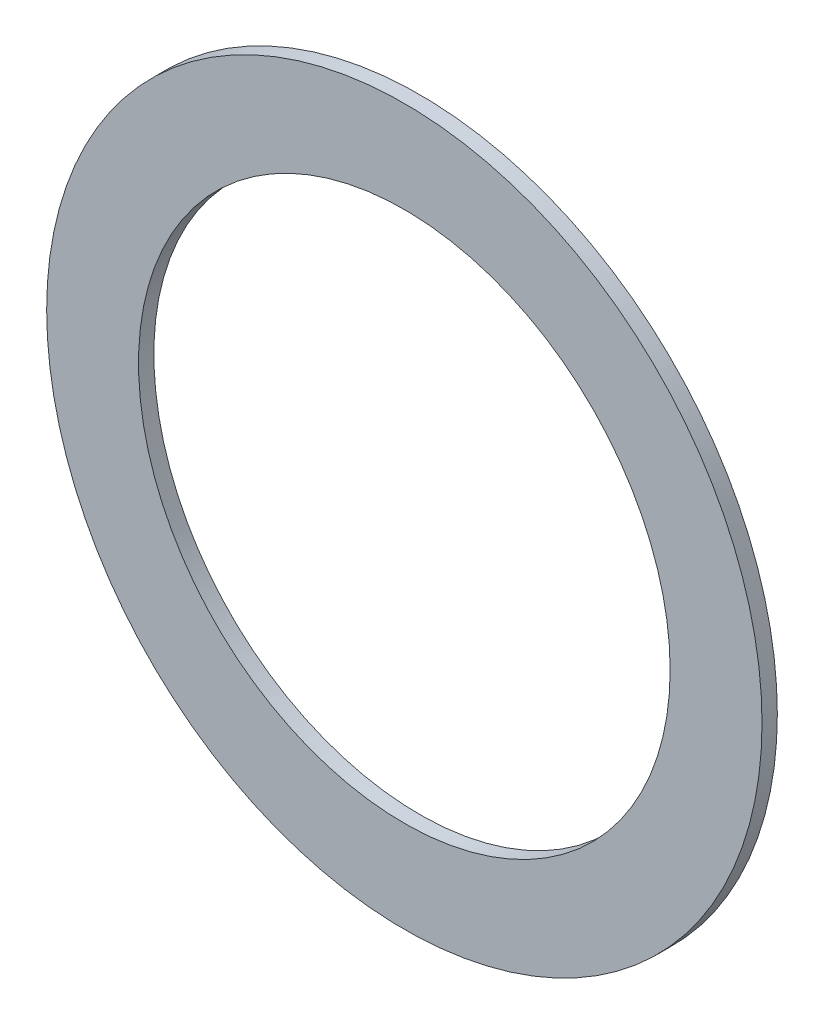
ISO-10303-21;
HEADER;
FILE_DESCRIPTION(('STEP AP214'),'2;1');
FILE_NAME('part.step','',(''),(''),'','','');
FILE_SCHEMA(('AUTOMOTIVE_DESIGN { 1 0 10303 214 1 1 1 1 }'));
ENDSEC;
DATA;
#1=APPLICATION_CONTEXT('core data for automotive mechanical design processes');
#2=APPLICATION_PROTOCOL_DEFINITION('international standard','automotive_design',2000,#1);
#3=PRODUCT_CONTEXT('',#1,'mechanical');
#4=PRODUCT('Part','Part','',(#3));
#5=PRODUCT_RELATED_PRODUCT_CATEGORY('part','',(#4));
#6=PRODUCT_DEFINITION_FORMATION('','',#4);
#7=PRODUCT_DEFINITION_CONTEXT('part definition',#1,'design');
#8=PRODUCT_DEFINITION('design','',#6,#7);
#9=PRODUCT_DEFINITION_SHAPE('','',#8);
#10=(LENGTH_UNIT() NAMED_UNIT(*) SI_UNIT(.MILLI.,.METRE.));
#11=(NAMED_UNIT(*) PLANE_ANGLE_UNIT() SI_UNIT($,.RADIAN.));
#12=(NAMED_UNIT(*) SI_UNIT($,.STERADIAN.) SOLID_ANGLE_UNIT());
#13=UNCERTAINTY_MEASURE_WITH_UNIT(LENGTH_MEASURE(1.E-05),#10,'distance_accuracy_value','');
#14=(GEOMETRIC_REPRESENTATION_CONTEXT(3) GLOBAL_UNCERTAINTY_ASSIGNED_CONTEXT((#13)) GLOBAL_UNIT_ASSIGNED_CONTEXT((#10,
#11,#12)) REPRESENTATION_CONTEXT('',''));
#15=CARTESIAN_POINT('',(0.,0.,0.));
#16=DIRECTION('',(0.,0.,1.));
#17=DIRECTION('',(1.,0.,0.));
#18=AXIS2_PLACEMENT_3D('',#15,#16,#17);
#19=CARTESIAN_POINT('',(0.,0.,2.5));
#20=DIRECTION('',(0.,0.,1.));
#21=DIRECTION('',(1.,0.,0.));
#22=AXIS2_PLACEMENT_3D('',#19,#20,#21);
#23=PLANE('',#22);
#24=CARTESIAN_POINT('',(0.,0.,2.5));
#25=DIRECTION('',(0.,0.,1.));
#26=DIRECTION('',(1.,0.,0.));
#27=AXIS2_PLACEMENT_3D('',#24,#25,#26);
#28=CIRCLE('',#27,116.8);
#29=CARTESIAN_POINT('',(116.8,0.,2.5));
#30=VERTEX_POINT('',#29);
#31=EDGE_CURVE('E11',#30,#30,#28,.T.);
#32=ORIENTED_EDGE('',*,*,#31,.T.);
#33=EDGE_LOOP('',(#32));
#34=FACE_BOUND('',#33,.T.);
#35=CARTESIAN_POINT('',(0.,0.,2.5));
#36=DIRECTION('',(0.,0.,1.));
#37=DIRECTION('',(1.,0.,0.));
#38=AXIS2_PLACEMENT_3D('',#35,#36,#37);
#39=CIRCLE('',#38,86.8);
#40=CARTESIAN_POINT('',(86.8,0.,2.5));
#41=VERTEX_POINT('',#40);
#42=EDGE_CURVE('E51',#41,#41,#39,.T.);
#43=ORIENTED_EDGE('',*,*,#42,.F.);
#44=EDGE_LOOP('',(#43));
#45=FACE_BOUND('',#44,.T.);
#46=ADVANCED_FACE('F40',(#34,#45),#23,.T.);
#47=CARTESIAN_POINT('',(0.,0.,-2.5));
#48=DIRECTION('',(0.,0.,1.));
#49=DIRECTION('',(1.,0.,0.));
#50=AXIS2_PLACEMENT_3D('',#47,#48,#49);
#51=PLANE('',#50);
#52=CARTESIAN_POINT('',(0.,0.,-2.5));
#53=DIRECTION('',(0.,0.,1.));
#54=DIRECTION('',(1.,0.,0.));
#55=AXIS2_PLACEMENT_3D('',#52,#53,#54);
#56=CIRCLE('',#55,116.8);
#57=CARTESIAN_POINT('',(116.8,0.,-2.5));
#58=VERTEX_POINT('',#57);
#59=EDGE_CURVE('E44',#58,#58,#56,.T.);
#60=ORIENTED_EDGE('',*,*,#59,.F.);
#61=EDGE_LOOP('',(#60));
#62=FACE_BOUND('',#61,.T.);
#63=CARTESIAN_POINT('',(0.,0.,-2.5));
#64=DIRECTION('',(0.,0.,1.));
#65=DIRECTION('',(1.,0.,0.));
#66=AXIS2_PLACEMENT_3D('',#63,#64,#65);
#67=CIRCLE('',#66,86.8);
#68=CARTESIAN_POINT('',(86.8,0.,-2.5));
#69=VERTEX_POINT('',#68);
#70=EDGE_CURVE('E53',#69,#69,#67,.T.);
#71=ORIENTED_EDGE('',*,*,#70,.T.);
#72=EDGE_LOOP('',(#71));
#73=FACE_BOUND('',#72,.T.);
#74=ADVANCED_FACE('F63',(#62,#73),#51,.F.);
#75=CARTESIAN_POINT('',(0.,0.,2.5));
#76=DIRECTION('',(0.,0.,-1.));
#77=DIRECTION('',(-1.,0.,0.));
#78=AXIS2_PLACEMENT_3D('',#75,#76,#77);
#79=CYLINDRICAL_SURFACE('',#78,116.8);
#80=ORIENTED_EDGE('',*,*,#31,.F.);
#81=EDGE_LOOP('',(#80));
#82=FACE_BOUND('',#81,.T.);
#83=ORIENTED_EDGE('',*,*,#59,.T.);
#84=EDGE_LOOP('',(#83));
#85=FACE_BOUND('',#84,.T.);
#86=ADVANCED_FACE('F42',(#82,#85),#79,.T.);
#87=CARTESIAN_POINT('',(0.,0.,2.5));
#88=DIRECTION('',(0.,0.,-1.));
#89=DIRECTION('',(-1.,0.,0.));
#90=AXIS2_PLACEMENT_3D('',#87,#88,#89);
#91=CYLINDRICAL_SURFACE('',#90,86.8);
#92=ORIENTED_EDGE('',*,*,#42,.T.);
#93=EDGE_LOOP('',(#92));
#94=FACE_BOUND('',#93,.T.);
#95=ORIENTED_EDGE('',*,*,#70,.F.);
#96=EDGE_LOOP('',(#95));
#97=FACE_BOUND('',#96,.T.);
#98=ADVANCED_FACE('F59',(#94,#97),#91,.F.);
#99=CLOSED_SHELL('',(#46,#74,#86,#98));
#100=MANIFOLD_SOLID_BREP('B2',#99);
#101=ADVANCED_BREP_SHAPE_REPRESENTATION('',(#18,#100),#14);
#102=SHAPE_DEFINITION_REPRESENTATION(#9,#101);
ENDSEC;
END-ISO-10303-21;
